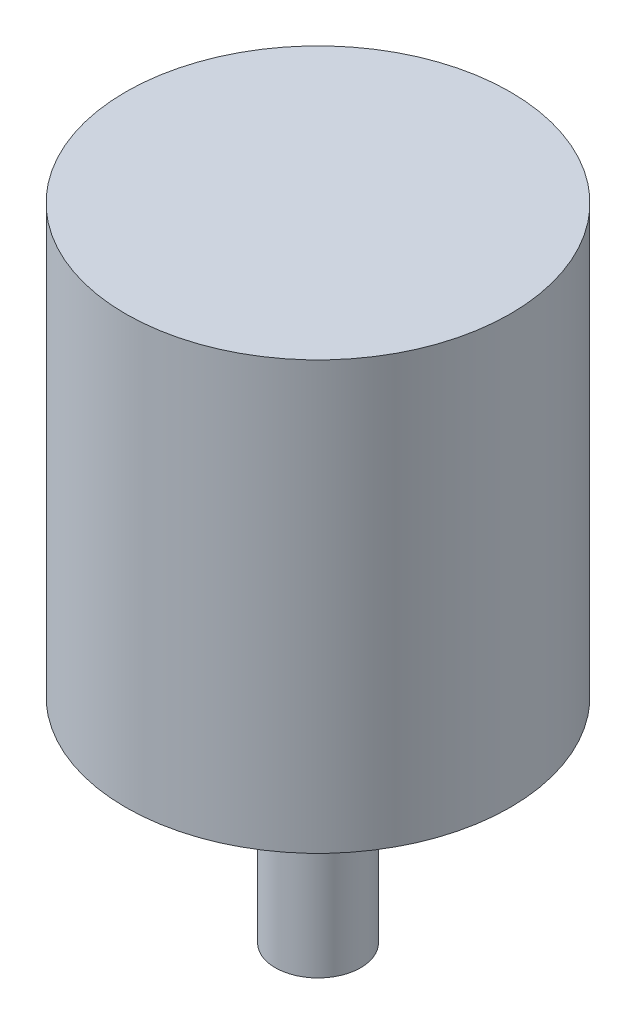
ISO-10303-21;
HEADER;
FILE_DESCRIPTION(('STEP AP214'),'2;1');
FILE_NAME('part.step','',(''),(''),'','','');
FILE_SCHEMA(('AUTOMOTIVE_DESIGN { 1 0 10303 214 1 1 1 1 }'));
ENDSEC;
DATA;
#1=APPLICATION_CONTEXT('core data for automotive mechanical design processes');
#2=APPLICATION_PROTOCOL_DEFINITION('international standard','automotive_design',2000,#1);
#3=PRODUCT_CONTEXT('',#1,'mechanical');
#4=PRODUCT('Part','Part','',(#3));
#5=PRODUCT_RELATED_PRODUCT_CATEGORY('part','',(#4));
#6=PRODUCT_DEFINITION_FORMATION('','',#4);
#7=PRODUCT_DEFINITION_CONTEXT('part definition',#1,'design');
#8=PRODUCT_DEFINITION('design','',#6,#7);
#9=PRODUCT_DEFINITION_SHAPE('','',#8);
#10=(LENGTH_UNIT() NAMED_UNIT(*) SI_UNIT(.MILLI.,.METRE.));
#11=(NAMED_UNIT(*) PLANE_ANGLE_UNIT() SI_UNIT($,.RADIAN.));
#12=(NAMED_UNIT(*) SI_UNIT($,.STERADIAN.) SOLID_ANGLE_UNIT());
#13=UNCERTAINTY_MEASURE_WITH_UNIT(LENGTH_MEASURE(1.E-05),#10,'distance_accuracy_value','');
#14=(GEOMETRIC_REPRESENTATION_CONTEXT(3) GLOBAL_UNCERTAINTY_ASSIGNED_CONTEXT((#13)) GLOBAL_UNIT_ASSIGNED_CONTEXT((#10,
#11,#12)) REPRESENTATION_CONTEXT('',''));
#15=CARTESIAN_POINT('',(0.,0.,0.));
#16=DIRECTION('',(0.,0.,1.));
#17=DIRECTION('',(1.,0.,0.));
#18=AXIS2_PLACEMENT_3D('',#15,#16,#17);
#19=CARTESIAN_POINT('',(0.,40.,0.));
#20=DIRECTION('',(0.,-1.,0.));
#21=DIRECTION('',(0.,0.,-1.));
#22=AXIS2_PLACEMENT_3D('',#19,#20,#21);
#23=CYLINDRICAL_SURFACE('',#22,18.);
#24=CARTESIAN_POINT('',(0.,40.,0.));
#25=DIRECTION('',(0.,1.,0.));
#26=DIRECTION('',(0.,0.,1.));
#27=AXIS2_PLACEMENT_3D('',#24,#25,#26);
#28=CIRCLE('',#27,18.);
#29=CARTESIAN_POINT('',(0.,40.,18.));
#30=VERTEX_POINT('',#29);
#31=EDGE_CURVE('E103',#30,#30,#28,.T.);
#32=ORIENTED_EDGE('',*,*,#31,.F.);
#33=EDGE_LOOP('',(#32));
#34=FACE_BOUND('',#33,.T.);
#35=CARTESIAN_POINT('',(0.,0.,0.));
#36=DIRECTION('',(0.,1.,0.));
#37=DIRECTION('',(0.,0.,1.));
#38=AXIS2_PLACEMENT_3D('',#35,#36,#37);
#39=CIRCLE('',#38,18.);
#40=CARTESIAN_POINT('',(0.,0.,18.));
#41=VERTEX_POINT('',#40);
#42=EDGE_CURVE('E100',#41,#41,#39,.T.);
#43=ORIENTED_EDGE('',*,*,#42,.T.);
#44=EDGE_LOOP('',(#43));
#45=FACE_BOUND('',#44,.T.);
#46=ADVANCED_FACE('F32',(#34,#45),#23,.T.);
#47=CARTESIAN_POINT('',(0.,40.,0.));
#48=DIRECTION('',(0.,1.,0.));
#49=DIRECTION('',(0.,0.,1.));
#50=AXIS2_PLACEMENT_3D('',#47,#48,#49);
#51=PLANE('',#50);
#52=ORIENTED_EDGE('',*,*,#31,.T.);
#53=EDGE_LOOP('',(#52));
#54=FACE_BOUND('',#53,.T.);
#55=ADVANCED_FACE('F112',(#54),#51,.T.);
#56=CARTESIAN_POINT('',(0.,0.,0.));
#57=DIRECTION('',(0.,1.,0.));
#58=DIRECTION('',(0.,0.,1.));
#59=AXIS2_PLACEMENT_3D('',#56,#57,#58);
#60=PLANE('',#59);
#61=CARTESIAN_POINT('',(0.,0.,0.));
#62=DIRECTION('',(0.,1.,0.));
#63=DIRECTION('',(0.,0.,1.));
#64=AXIS2_PLACEMENT_3D('',#61,#62,#63);
#65=CIRCLE('',#64,11.);
#66=CARTESIAN_POINT('',(0.,0.,11.));
#67=VERTEX_POINT('',#66);
#68=EDGE_CURVE('E35',#67,#67,#65,.F.);
#69=ORIENTED_EDGE('',*,*,#68,.F.);
#70=EDGE_LOOP('',(#69));
#71=FACE_BOUND('',#70,.T.);
#72=CARTESIAN_POINT('',(0.,0.,15.));
#73=DIRECTION('',(0.,-1.,0.));
#74=DIRECTION('',(-1.,0.,0.));
#75=AXIS2_PLACEMENT_3D('',#72,#73,#74);
#76=CIRCLE('',#75,1.5);
#77=CARTESIAN_POINT('',(-1.49999999999995,0.,15.));
#78=VERTEX_POINT('',#77);
#79=EDGE_CURVE('E83',#78,#78,#76,.T.);
#80=ORIENTED_EDGE('',*,*,#79,.F.);
#81=EDGE_LOOP('',(#80));
#82=FACE_BOUND('',#81,.T.);
#83=CARTESIAN_POINT('',(15.,0.,0.));
#84=DIRECTION('',(0.,-1.,0.));
#85=DIRECTION('',(0.,0.,1.));
#86=AXIS2_PLACEMENT_3D('',#83,#84,#85);
#87=CIRCLE('',#86,1.5);
#88=CARTESIAN_POINT('',(15.,0.,1.5));
#89=VERTEX_POINT('',#88);
#90=EDGE_CURVE('E89',#89,#89,#87,.T.);
#91=ORIENTED_EDGE('',*,*,#90,.F.);
#92=EDGE_LOOP('',(#91));
#93=FACE_BOUND('',#92,.T.);
#94=CARTESIAN_POINT('',(-1.57116660247941E-13,0.,-15.));
#95=DIRECTION('',(0.,-1.,0.));
#96=DIRECTION('',(1.,0.,0.));
#97=AXIS2_PLACEMENT_3D('',#94,#95,#96);
#98=CIRCLE('',#97,1.5);
#99=CARTESIAN_POINT('',(1.49999999999984,0.,-15.));
#100=VERTEX_POINT('',#99);
#101=EDGE_CURVE('E75',#100,#100,#98,.T.);
#102=ORIENTED_EDGE('',*,*,#101,.F.);
#103=EDGE_LOOP('',(#102));
#104=FACE_BOUND('',#103,.T.);
#105=CARTESIAN_POINT('',(-15.,0.,0.));
#106=DIRECTION('',(0.,-1.,0.));
#107=DIRECTION('',(0.,0.,-1.));
#108=AXIS2_PLACEMENT_3D('',#105,#106,#107);
#109=CIRCLE('',#108,1.5);
#110=CARTESIAN_POINT('',(-15.,0.,-1.5));
#111=VERTEX_POINT('',#110);
#112=EDGE_CURVE('E82',#111,#111,#109,.T.);
#113=ORIENTED_EDGE('',*,*,#112,.F.);
#114=EDGE_LOOP('',(#113));
#115=FACE_BOUND('',#114,.T.);
#116=ORIENTED_EDGE('',*,*,#42,.F.);
#117=EDGE_LOOP('',(#116));
#118=FACE_BOUND('',#117,.T.);
#119=ADVANCED_FACE('F109',(#71,#82,#93,#104,#115,#118),#60,.F.);
#120=CARTESIAN_POINT('',(-15.,5.,0.));
#121=DIRECTION('',(0.,-1.,0.));
#122=DIRECTION('',(0.,0.,-1.));
#123=AXIS2_PLACEMENT_3D('',#120,#121,#122);
#124=CYLINDRICAL_SURFACE('',#123,1.5);
#125=CARTESIAN_POINT('',(-15.,5.,0.));
#126=DIRECTION('',(0.,-1.,0.));
#127=DIRECTION('',(0.,0.,-1.));
#128=AXIS2_PLACEMENT_3D('',#125,#126,#127);
#129=CIRCLE('',#128,1.5);
#130=CARTESIAN_POINT('',(-15.,5.,-1.5));
#131=VERTEX_POINT('',#130);
#132=EDGE_CURVE('E97',#131,#131,#129,.T.);
#133=ORIENTED_EDGE('',*,*,#132,.F.);
#134=EDGE_LOOP('',(#133));
#135=FACE_BOUND('',#134,.T.);
#136=ORIENTED_EDGE('',*,*,#112,.T.);
#137=EDGE_LOOP('',(#136));
#138=FACE_BOUND('',#137,.T.);
#139=ADVANCED_FACE('F111',(#135,#138),#124,.F.);
#140=CARTESIAN_POINT('',(-15.,5.,0.));
#141=DIRECTION('',(0.,-1.,0.));
#142=DIRECTION('',(0.,0.,-1.));
#143=AXIS2_PLACEMENT_3D('',#140,#141,#142);
#144=PLANE('',#143);
#145=ORIENTED_EDGE('',*,*,#132,.T.);
#146=EDGE_LOOP('',(#145));
#147=FACE_BOUND('',#146,.T.);
#148=ADVANCED_FACE('F118',(#147),#144,.T.);
#149=CARTESIAN_POINT('',(-1.57116660247941E-13,5.,-15.));
#150=DIRECTION('',(0.,-1.,0.));
#151=DIRECTION('',(0.,0.,-1.));
#152=AXIS2_PLACEMENT_3D('',#149,#150,#151);
#153=CYLINDRICAL_SURFACE('',#152,1.5);
#154=CARTESIAN_POINT('',(-1.57116660247941E-13,5.,-15.));
#155=DIRECTION('',(0.,-1.,0.));
#156=DIRECTION('',(1.,0.,0.));
#157=AXIS2_PLACEMENT_3D('',#154,#155,#156);
#158=CIRCLE('',#157,1.5);
#159=CARTESIAN_POINT('',(1.49999999999984,5.,-15.));
#160=VERTEX_POINT('',#159);
#161=EDGE_CURVE('E92',#160,#160,#158,.T.);
#162=ORIENTED_EDGE('',*,*,#161,.F.);
#163=EDGE_LOOP('',(#162));
#164=FACE_BOUND('',#163,.T.);
#165=ORIENTED_EDGE('',*,*,#101,.T.);
#166=EDGE_LOOP('',(#165));
#167=FACE_BOUND('',#166,.T.);
#168=ADVANCED_FACE('F150',(#164,#167),#153,.F.);
#169=CARTESIAN_POINT('',(-1.57116660247941E-13,5.,-15.));
#170=DIRECTION('',(0.,-1.,0.));
#171=DIRECTION('',(1.,0.,0.));
#172=AXIS2_PLACEMENT_3D('',#169,#170,#171);
#173=PLANE('',#172);
#174=ORIENTED_EDGE('',*,*,#161,.T.);
#175=EDGE_LOOP('',(#174));
#176=FACE_BOUND('',#175,.T.);
#177=ADVANCED_FACE('F160',(#176),#173,.T.);
#178=CARTESIAN_POINT('',(15.,5.,0.));
#179=DIRECTION('',(0.,-1.,0.));
#180=DIRECTION('',(0.,0.,-1.));
#181=AXIS2_PLACEMENT_3D('',#178,#179,#180);
#182=CYLINDRICAL_SURFACE('',#181,1.5);
#183=CARTESIAN_POINT('',(15.,5.,0.));
#184=DIRECTION('',(0.,-1.,0.));
#185=DIRECTION('',(0.,0.,1.));
#186=AXIS2_PLACEMENT_3D('',#183,#184,#185);
#187=CIRCLE('',#186,1.5);
#188=CARTESIAN_POINT('',(15.,5.,1.5));
#189=VERTEX_POINT('',#188);
#190=EDGE_CURVE('E86',#189,#189,#187,.T.);
#191=ORIENTED_EDGE('',*,*,#190,.F.);
#192=EDGE_LOOP('',(#191));
#193=FACE_BOUND('',#192,.T.);
#194=ORIENTED_EDGE('',*,*,#90,.T.);
#195=EDGE_LOOP('',(#194));
#196=FACE_BOUND('',#195,.T.);
#197=ADVANCED_FACE('F170',(#193,#196),#182,.F.);
#198=CARTESIAN_POINT('',(15.,5.,0.));
#199=DIRECTION('',(0.,-1.,0.));
#200=DIRECTION('',(0.,0.,1.));
#201=AXIS2_PLACEMENT_3D('',#198,#199,#200);
#202=PLANE('',#201);
#203=ORIENTED_EDGE('',*,*,#190,.T.);
#204=EDGE_LOOP('',(#203));
#205=FACE_BOUND('',#204,.T.);
#206=ADVANCED_FACE('F180',(#205),#202,.T.);
#207=CARTESIAN_POINT('',(0.,5.,15.));
#208=DIRECTION('',(0.,-1.,0.));
#209=DIRECTION('',(0.,0.,-1.));
#210=AXIS2_PLACEMENT_3D('',#207,#208,#209);
#211=CYLINDRICAL_SURFACE('',#210,1.5);
#212=CARTESIAN_POINT('',(0.,5.,15.));
#213=DIRECTION('',(0.,-1.,0.));
#214=DIRECTION('',(-1.,0.,0.));
#215=AXIS2_PLACEMENT_3D('',#212,#213,#214);
#216=CIRCLE('',#215,1.5);
#217=CARTESIAN_POINT('',(-1.49999999999995,5.,15.));
#218=VERTEX_POINT('',#217);
#219=EDGE_CURVE('E79',#218,#218,#216,.T.);
#220=ORIENTED_EDGE('',*,*,#219,.F.);
#221=EDGE_LOOP('',(#220));
#222=FACE_BOUND('',#221,.T.);
#223=ORIENTED_EDGE('',*,*,#79,.T.);
#224=EDGE_LOOP('',(#223));
#225=FACE_BOUND('',#224,.T.);
#226=ADVANCED_FACE('F190',(#222,#225),#211,.F.);
#227=CARTESIAN_POINT('',(0.,5.,15.));
#228=DIRECTION('',(0.,-1.,0.));
#229=DIRECTION('',(-1.,0.,0.));
#230=AXIS2_PLACEMENT_3D('',#227,#228,#229);
#231=PLANE('',#230);
#232=ORIENTED_EDGE('',*,*,#219,.T.);
#233=EDGE_LOOP('',(#232));
#234=FACE_BOUND('',#233,.T.);
#235=ADVANCED_FACE('F200',(#234),#231,.T.);
#236=CARTESIAN_POINT('',(0.,-3.,0.));
#237=DIRECTION('',(0.,1.,0.));
#238=DIRECTION('',(0.,0.,1.));
#239=AXIS2_PLACEMENT_3D('',#236,#237,#238);
#240=CYLINDRICAL_SURFACE('',#239,11.);
#241=CARTESIAN_POINT('',(0.,-3.,0.));
#242=DIRECTION('',(0.,-1.,0.));
#243=DIRECTION('',(0.,0.,-1.));
#244=AXIS2_PLACEMENT_3D('',#241,#242,#243);
#245=CIRCLE('',#244,11.);
#246=CARTESIAN_POINT('',(0.,-3.,-11.));
#247=VERTEX_POINT('',#246);
#248=EDGE_CURVE('E72',#247,#247,#245,.T.);
#249=ORIENTED_EDGE('',*,*,#248,.F.);
#250=EDGE_LOOP('',(#249));
#251=FACE_BOUND('',#250,.T.);
#252=ORIENTED_EDGE('',*,*,#68,.T.);
#253=EDGE_LOOP('',(#252));
#254=FACE_BOUND('',#253,.T.);
#255=ADVANCED_FACE('F209',(#251,#254),#240,.T.);
#256=CARTESIAN_POINT('',(0.,-3.,0.));
#257=DIRECTION('',(0.,-1.,0.));
#258=DIRECTION('',(0.,0.,-1.));
#259=AXIS2_PLACEMENT_3D('',#256,#257,#258);
#260=PLANE('',#259);
#261=CARTESIAN_POINT('',(0.,-3.,0.));
#262=DIRECTION('',(0.,-1.,0.));
#263=DIRECTION('',(0.,0.,-1.));
#264=AXIS2_PLACEMENT_3D('',#261,#262,#263);
#265=CIRCLE('',#264,4.);
#266=CARTESIAN_POINT('',(0.,-3.,-4.));
#267=VERTEX_POINT('',#266);
#268=EDGE_CURVE('E11',#267,#267,#265,.T.);
#269=ORIENTED_EDGE('',*,*,#268,.F.);
#270=EDGE_LOOP('',(#269));
#271=FACE_BOUND('',#270,.T.);
#272=ORIENTED_EDGE('',*,*,#248,.T.);
#273=EDGE_LOOP('',(#272));
#274=FACE_BOUND('',#273,.T.);
#275=ADVANCED_FACE('F223',(#271,#274),#260,.T.);
#276=CARTESIAN_POINT('',(0.,-20.,0.));
#277=DIRECTION('',(0.,1.,0.));
#278=DIRECTION('',(0.,0.,1.));
#279=AXIS2_PLACEMENT_3D('',#276,#277,#278);
#280=CYLINDRICAL_SURFACE('',#279,4.);
#281=CARTESIAN_POINT('',(0.,-20.,0.));
#282=DIRECTION('',(0.,-1.,0.));
#283=DIRECTION('',(0.,0.,-1.));
#284=AXIS2_PLACEMENT_3D('',#281,#282,#283);
#285=CIRCLE('',#284,4.);
#286=CARTESIAN_POINT('',(2.64575131106459,-20.,-3.));
#287=VERTEX_POINT('',#286);
#288=CARTESIAN_POINT('',(-2.64575131106459,-20.,-3.));
#289=VERTEX_POINT('',#288);
#290=EDGE_CURVE('E69',#287,#289,#285,.T.);
#291=ORIENTED_EDGE('',*,*,#290,.F.);
#292=DIRECTION('',(0.,-1.,0.));
#293=VECTOR('',#292,1.);
#294=CARTESIAN_POINT('',(2.64575131106459,-5.,-3.));
#295=LINE('',#294,#293);
#296=CARTESIAN_POINT('',(2.64575131106459,-5.,-3.));
#297=VERTEX_POINT('',#296);
#298=EDGE_CURVE('E47',#297,#287,#295,.T.);
#299=ORIENTED_EDGE('',*,*,#298,.F.);
#300=CARTESIAN_POINT('',(0.,-5.,0.));
#301=DIRECTION('',(0.,-1.,0.));
#302=DIRECTION('',(0.,0.,1.));
#303=AXIS2_PLACEMENT_3D('',#300,#301,#302);
#304=CIRCLE('',#303,4.);
#305=CARTESIAN_POINT('',(-2.64575131106459,-5.,-3.));
#306=VERTEX_POINT('',#305);
#307=EDGE_CURVE('E63',#306,#297,#304,.T.);
#308=ORIENTED_EDGE('',*,*,#307,.F.);
#309=DIRECTION('',(0.,-1.,0.));
#310=VECTOR('',#309,1.);
#311=CARTESIAN_POINT('',(-2.64575131106459,-5.,-3.));
#312=LINE('',#311,#310);
#313=EDGE_CURVE('E53',#306,#289,#312,.T.);
#314=ORIENTED_EDGE('',*,*,#313,.T.);
#315=EDGE_LOOP('',(#291,#299,#308,#314));
#316=FACE_BOUND('',#315,.T.);
#317=ORIENTED_EDGE('',*,*,#268,.T.);
#318=EDGE_LOOP('',(#317));
#319=FACE_BOUND('',#318,.T.);
#320=ADVANCED_FACE('F67',(#316,#319),#280,.T.);
#321=CARTESIAN_POINT('',(0.,-20.,0.));
#322=DIRECTION('',(0.,-1.,0.));
#323=DIRECTION('',(0.,0.,-1.));
#324=AXIS2_PLACEMENT_3D('',#321,#322,#323);
#325=PLANE('',#324);
#326=DIRECTION('',(-1.,0.,0.));
#327=VECTOR('',#326,1.);
#328=CARTESIAN_POINT('',(-2.64575131106459,-20.,-3.));
#329=LINE('',#328,#327);
#330=EDGE_CURVE('E58',#287,#289,#329,.T.);
#331=ORIENTED_EDGE('',*,*,#330,.F.);
#332=ORIENTED_EDGE('',*,*,#290,.T.);
#333=EDGE_LOOP('',(#331,#332));
#334=FACE_BOUND('',#333,.T.);
#335=ADVANCED_FACE('F71',(#334),#325,.T.);
#336=CARTESIAN_POINT('',(-2.64575131106459,-5.,-3.));
#337=DIRECTION('',(0.,0.,1.));
#338=DIRECTION('',(1.,0.,0.));
#339=AXIS2_PLACEMENT_3D('',#336,#337,#338);
#340=PLANE('',#339);
#341=ORIENTED_EDGE('',*,*,#330,.T.);
#342=ORIENTED_EDGE('',*,*,#313,.F.);
#343=DIRECTION('',(-1.,0.,0.));
#344=VECTOR('',#343,1.);
#345=CARTESIAN_POINT('',(-2.64575131106459,-5.,-3.));
#346=LINE('',#345,#344);
#347=EDGE_CURVE('E271',#297,#306,#346,.T.);
#348=ORIENTED_EDGE('',*,*,#347,.F.);
#349=ORIENTED_EDGE('',*,*,#298,.T.);
#350=EDGE_LOOP('',(#341,#342,#348,#349));
#351=FACE_BOUND('',#350,.T.);
#352=ADVANCED_FACE('F59',(#351),#340,.F.);
#353=CARTESIAN_POINT('',(0.,-5.,0.));
#354=DIRECTION('',(0.,1.,0.));
#355=DIRECTION('',(0.,0.,1.));
#356=AXIS2_PLACEMENT_3D('',#353,#354,#355);
#357=PLANE('',#356);
#358=ORIENTED_EDGE('',*,*,#307,.T.);
#359=ORIENTED_EDGE('',*,*,#347,.T.);
#360=EDGE_LOOP('',(#358,#359));
#361=FACE_BOUND('',#360,.T.);
#362=ADVANCED_FACE('F258',(#361),#357,.F.);
#363=CLOSED_SHELL('',(#46,#55,#119,#139,#148,#168,#177,#197,#206,#226,#235,#255,#275,#320,#335,
#352,#362));
#364=MANIFOLD_SOLID_BREP('B2',#363);
#365=ADVANCED_BREP_SHAPE_REPRESENTATION('',(#18,#364),#14);
#366=SHAPE_DEFINITION_REPRESENTATION(#9,#365);
ENDSEC;
END-ISO-10303-21;
